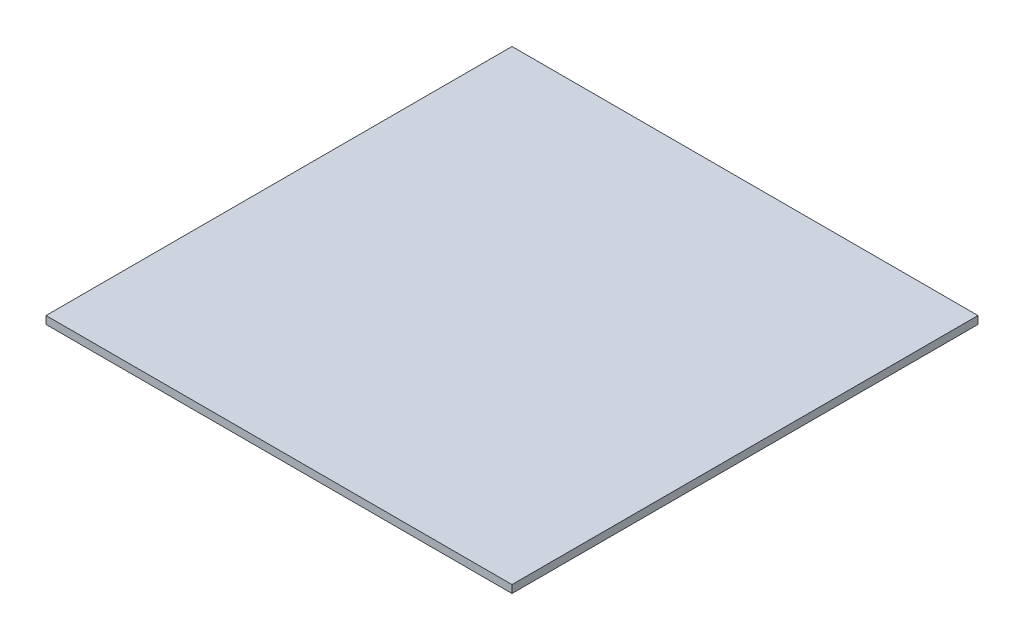
ISO-10303-21;
HEADER;
FILE_DESCRIPTION(('STEP AP214'),'2;1');
FILE_NAME('part.step','',(''),(''),'','','');
FILE_SCHEMA(('AUTOMOTIVE_DESIGN { 1 0 10303 214 1 1 1 1 }'));
ENDSEC;
DATA;
#1=APPLICATION_CONTEXT('core data for automotive mechanical design processes');
#2=APPLICATION_PROTOCOL_DEFINITION('international standard','automotive_design',2000,#1);
#3=PRODUCT_CONTEXT('',#1,'mechanical');
#4=PRODUCT('Part','Part','',(#3));
#5=PRODUCT_RELATED_PRODUCT_CATEGORY('part','',(#4));
#6=PRODUCT_DEFINITION_FORMATION('','',#4);
#7=PRODUCT_DEFINITION_CONTEXT('part definition',#1,'design');
#8=PRODUCT_DEFINITION('design','',#6,#7);
#9=PRODUCT_DEFINITION_SHAPE('','',#8);
#10=(LENGTH_UNIT() NAMED_UNIT(*) SI_UNIT(.MILLI.,.METRE.));
#11=(NAMED_UNIT(*) PLANE_ANGLE_UNIT() SI_UNIT($,.RADIAN.));
#12=(NAMED_UNIT(*) SI_UNIT($,.STERADIAN.) SOLID_ANGLE_UNIT());
#13=UNCERTAINTY_MEASURE_WITH_UNIT(LENGTH_MEASURE(1.E-05),#10,'distance_accuracy_value','');
#14=(GEOMETRIC_REPRESENTATION_CONTEXT(3) GLOBAL_UNCERTAINTY_ASSIGNED_CONTEXT((#13)) GLOBAL_UNIT_ASSIGNED_CONTEXT((#10,
#11,#12)) REPRESENTATION_CONTEXT('',''));
#15=CARTESIAN_POINT('',(0.,0.,0.));
#16=DIRECTION('',(0.,0.,1.));
#17=DIRECTION('',(1.,0.,0.));
#18=AXIS2_PLACEMENT_3D('',#15,#16,#17);
#19=CARTESIAN_POINT('',(0.,2.54,0.));
#20=DIRECTION('',(1.,0.,0.));
#21=DIRECTION('',(0.,0.,-1.));
#22=AXIS2_PLACEMENT_3D('',#19,#20,#21);
#23=PLANE('',#22);
#24=DIRECTION('',(0.,0.,1.));
#25=VECTOR('',#24,1.);
#26=CARTESIAN_POINT('',(0.,0.,0.));
#27=LINE('',#26,#25);
#28=CARTESIAN_POINT('',(0.,0.,-152.4));
#29=VERTEX_POINT('',#28);
#30=CARTESIAN_POINT('',(0.,0.,0.));
#31=VERTEX_POINT('',#30);
#32=EDGE_CURVE('E96',#29,#31,#27,.T.);
#33=ORIENTED_EDGE('',*,*,#32,.T.);
#34=DIRECTION('',(0.,-1.,0.));
#35=VECTOR('',#34,1.);
#36=CARTESIAN_POINT('',(0.,2.54,0.));
#37=LINE('',#36,#35);
#38=CARTESIAN_POINT('',(0.,2.54,0.));
#39=VERTEX_POINT('',#38);
#40=EDGE_CURVE('E11',#39,#31,#37,.T.);
#41=ORIENTED_EDGE('',*,*,#40,.F.);
#42=DIRECTION('',(0.,0.,1.));
#43=VECTOR('',#42,1.);
#44=CARTESIAN_POINT('',(0.,2.54,0.));
#45=LINE('',#44,#43);
#46=CARTESIAN_POINT('',(0.,2.54,-152.4));
#47=VERTEX_POINT('',#46);
#48=EDGE_CURVE('E84',#47,#39,#45,.T.);
#49=ORIENTED_EDGE('',*,*,#48,.F.);
#50=DIRECTION('',(0.,-1.,0.));
#51=VECTOR('',#50,1.);
#52=CARTESIAN_POINT('',(0.,2.54,-152.4));
#53=LINE('',#52,#51);
#54=EDGE_CURVE('E92',#47,#29,#53,.T.);
#55=ORIENTED_EDGE('',*,*,#54,.T.);
#56=EDGE_LOOP('',(#33,#41,#49,#55));
#57=FACE_BOUND('',#56,.T.);
#58=ADVANCED_FACE('F33',(#57),#23,.F.);
#59=CARTESIAN_POINT('',(0.,2.54,0.));
#60=DIRECTION('',(0.,0.,-1.));
#61=DIRECTION('',(-1.,0.,0.));
#62=AXIS2_PLACEMENT_3D('',#59,#60,#61);
#63=PLANE('',#62);
#64=DIRECTION('',(1.,0.,0.));
#65=VECTOR('',#64,1.);
#66=CARTESIAN_POINT('',(0.,0.,0.));
#67=LINE('',#66,#65);
#68=CARTESIAN_POINT('',(152.4,0.,0.));
#69=VERTEX_POINT('',#68);
#70=EDGE_CURVE('E88',#31,#69,#67,.T.);
#71=ORIENTED_EDGE('',*,*,#70,.T.);
#72=DIRECTION('',(0.,-1.,0.));
#73=VECTOR('',#72,1.);
#74=CARTESIAN_POINT('',(152.4,2.54,0.));
#75=LINE('',#74,#73);
#76=CARTESIAN_POINT('',(152.4,2.54,0.));
#77=VERTEX_POINT('',#76);
#78=EDGE_CURVE('E41',#77,#69,#75,.T.);
#79=ORIENTED_EDGE('',*,*,#78,.F.);
#80=DIRECTION('',(1.,0.,0.));
#81=VECTOR('',#80,1.);
#82=CARTESIAN_POINT('',(0.,2.54,0.));
#83=LINE('',#82,#81);
#84=EDGE_CURVE('E79',#39,#77,#83,.T.);
#85=ORIENTED_EDGE('',*,*,#84,.F.);
#86=ORIENTED_EDGE('',*,*,#40,.T.);
#87=EDGE_LOOP('',(#71,#79,#85,#86));
#88=FACE_BOUND('',#87,.T.);
#89=ADVANCED_FACE('F87',(#88),#63,.F.);
#90=CARTESIAN_POINT('',(152.4,2.54,0.));
#91=DIRECTION('',(-1.,0.,0.));
#92=DIRECTION('',(0.,0.,1.));
#93=AXIS2_PLACEMENT_3D('',#90,#91,#92);
#94=PLANE('',#93);
#95=DIRECTION('',(0.,0.,-1.));
#96=VECTOR('',#95,1.);
#97=CARTESIAN_POINT('',(152.4,0.,0.));
#98=LINE('',#97,#96);
#99=CARTESIAN_POINT('',(152.4,0.,-152.4));
#100=VERTEX_POINT('',#99);
#101=EDGE_CURVE('E66',#69,#100,#98,.T.);
#102=ORIENTED_EDGE('',*,*,#101,.T.);
#103=DIRECTION('',(0.,-1.,0.));
#104=VECTOR('',#103,1.);
#105=CARTESIAN_POINT('',(152.4,2.54,-152.4));
#106=LINE('',#105,#104);
#107=CARTESIAN_POINT('',(152.4,2.54,-152.4));
#108=VERTEX_POINT('',#107);
#109=EDGE_CURVE('E89',#108,#100,#106,.T.);
#110=ORIENTED_EDGE('',*,*,#109,.F.);
#111=DIRECTION('',(0.,0.,-1.));
#112=VECTOR('',#111,1.);
#113=CARTESIAN_POINT('',(152.4,2.54,0.));
#114=LINE('',#113,#112);
#115=EDGE_CURVE('E82',#77,#108,#114,.T.);
#116=ORIENTED_EDGE('',*,*,#115,.F.);
#117=ORIENTED_EDGE('',*,*,#78,.T.);
#118=EDGE_LOOP('',(#102,#110,#116,#117));
#119=FACE_BOUND('',#118,.T.);
#120=ADVANCED_FACE('F90',(#119),#94,.F.);
#121=CARTESIAN_POINT('',(0.,2.54,-152.4));
#122=DIRECTION('',(0.,0.,1.));
#123=DIRECTION('',(1.,0.,0.));
#124=AXIS2_PLACEMENT_3D('',#121,#122,#123);
#125=PLANE('',#124);
#126=DIRECTION('',(-1.,0.,0.));
#127=VECTOR('',#126,1.);
#128=CARTESIAN_POINT('',(0.,0.,-152.4));
#129=LINE('',#128,#127);
#130=EDGE_CURVE('E72',#100,#29,#129,.T.);
#131=ORIENTED_EDGE('',*,*,#130,.T.);
#132=ORIENTED_EDGE('',*,*,#54,.F.);
#133=DIRECTION('',(-1.,0.,0.));
#134=VECTOR('',#133,1.);
#135=CARTESIAN_POINT('',(0.,2.54,-152.4));
#136=LINE('',#135,#134);
#137=EDGE_CURVE('E49',#108,#47,#136,.T.);
#138=ORIENTED_EDGE('',*,*,#137,.F.);
#139=ORIENTED_EDGE('',*,*,#109,.T.);
#140=EDGE_LOOP('',(#131,#132,#138,#139));
#141=FACE_BOUND('',#140,.T.);
#142=ADVANCED_FACE('F103',(#141),#125,.F.);
#143=CARTESIAN_POINT('',(0.,2.54,0.));
#144=DIRECTION('',(0.,-1.,0.));
#145=DIRECTION('',(0.,0.,-1.));
#146=AXIS2_PLACEMENT_3D('',#143,#144,#145);
#147=PLANE('',#146);
#148=ORIENTED_EDGE('',*,*,#48,.T.);
#149=ORIENTED_EDGE('',*,*,#84,.T.);
#150=ORIENTED_EDGE('',*,*,#115,.T.);
#151=ORIENTED_EDGE('',*,*,#137,.T.);
#152=EDGE_LOOP('',(#148,#149,#150,#151));
#153=FACE_BOUND('',#152,.T.);
#154=ADVANCED_FACE('F80',(#153),#147,.F.);
#155=CARTESIAN_POINT('',(0.,0.,0.));
#156=DIRECTION('',(0.,-1.,0.));
#157=DIRECTION('',(0.,0.,-1.));
#158=AXIS2_PLACEMENT_3D('',#155,#156,#157);
#159=PLANE('',#158);
#160=ORIENTED_EDGE('',*,*,#32,.F.);
#161=ORIENTED_EDGE('',*,*,#130,.F.);
#162=ORIENTED_EDGE('',*,*,#101,.F.);
#163=ORIENTED_EDGE('',*,*,#70,.F.);
#164=EDGE_LOOP('',(#160,#161,#162,#163));
#165=FACE_BOUND('',#164,.T.);
#166=ADVANCED_FACE('F106',(#165),#159,.T.);
#167=CLOSED_SHELL('',(#58,#89,#120,#142,#154,#166));
#168=MANIFOLD_SOLID_BREP('B2',#167);
#169=ADVANCED_BREP_SHAPE_REPRESENTATION('',(#18,#168),#14);
#170=SHAPE_DEFINITION_REPRESENTATION(#9,#169);
ENDSEC;
END-ISO-10303-21;
